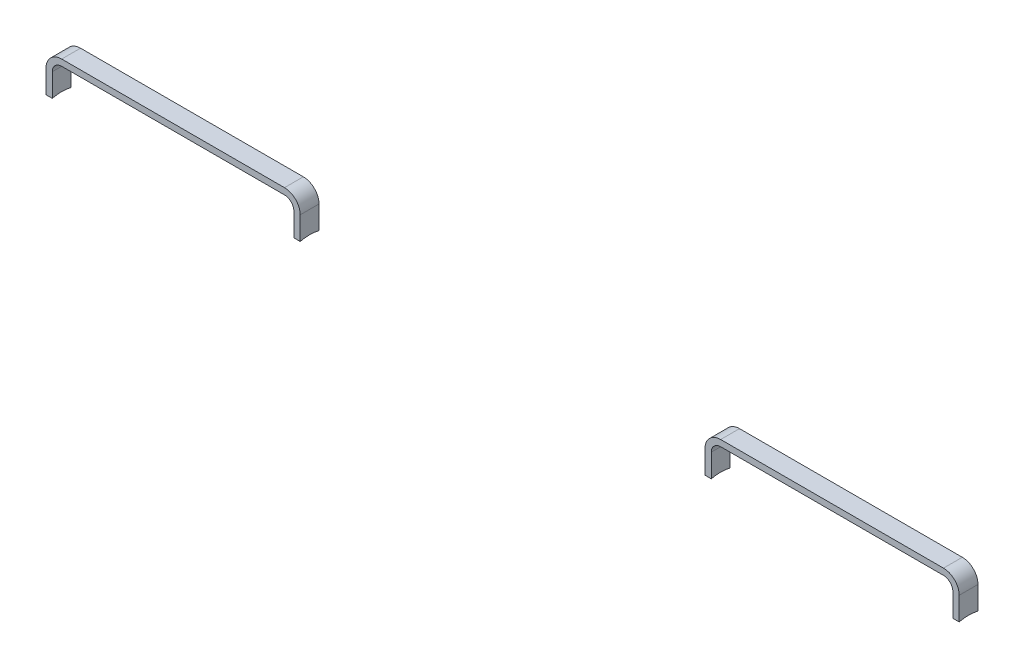
ISO-10303-21;
HEADER;
FILE_DESCRIPTION(('STEP AP214'),'2;1');
FILE_NAME('part.step','',(''),(''),'','','');
FILE_SCHEMA(('AUTOMOTIVE_DESIGN { 1 0 10303 214 1 1 1 1 }'));
ENDSEC;
DATA;
#1=APPLICATION_CONTEXT('core data for automotive mechanical design processes');
#2=APPLICATION_PROTOCOL_DEFINITION('international standard','automotive_design',2000,#1);
#3=PRODUCT_CONTEXT('',#1,'mechanical');
#4=PRODUCT('Part','Part','',(#3));
#5=PRODUCT_RELATED_PRODUCT_CATEGORY('part','',(#4));
#6=PRODUCT_DEFINITION_FORMATION('','',#4);
#7=PRODUCT_DEFINITION_CONTEXT('part definition',#1,'design');
#8=PRODUCT_DEFINITION('design','',#6,#7);
#9=PRODUCT_DEFINITION_SHAPE('','',#8);
#10=(LENGTH_UNIT() NAMED_UNIT(*) SI_UNIT(.MILLI.,.METRE.));
#11=(NAMED_UNIT(*) PLANE_ANGLE_UNIT() SI_UNIT($,.RADIAN.));
#12=(NAMED_UNIT(*) SI_UNIT($,.STERADIAN.) SOLID_ANGLE_UNIT());
#13=UNCERTAINTY_MEASURE_WITH_UNIT(LENGTH_MEASURE(1.E-05),#10,'distance_accuracy_value','');
#14=(GEOMETRIC_REPRESENTATION_CONTEXT(3) GLOBAL_UNCERTAINTY_ASSIGNED_CONTEXT((#13)) GLOBAL_UNIT_ASSIGNED_CONTEXT((#10,
#11,#12)) REPRESENTATION_CONTEXT('',''));
#15=CARTESIAN_POINT('',(0.,0.,0.));
#16=DIRECTION('',(0.,0.,1.));
#17=DIRECTION('',(1.,0.,0.));
#18=AXIS2_PLACEMENT_3D('',#15,#16,#17);
#19=CARTESIAN_POINT('',(140.5,609.700009353267,-1580.));
#20=DIRECTION('',(0.,0.,1.));
#21=DIRECTION('',(0.,-1.,0.));
#22=AXIS2_PLACEMENT_3D('',#19,#20,#21);
#23=CYLINDRICAL_SURFACE('',#22,5.);
#24=CARTESIAN_POINT('',(140.5,609.700009353267,-1577.));
#25=DIRECTION('',(0.,0.,-1.));
#26=DIRECTION('',(-1.,0.,0.));
#27=AXIS2_PLACEMENT_3D('',#24,#25,#26);
#28=CIRCLE('',#27,5.);
#29=CARTESIAN_POINT('',(140.5,614.700009353267,-1577.));
#30=VERTEX_POINT('',#29);
#31=CARTESIAN_POINT('',(145.5,609.700009353267,-1577.));
#32=VERTEX_POINT('',#31);
#33=EDGE_CURVE('E237',#30,#32,#28,.T.);
#34=ORIENTED_EDGE('',*,*,#33,.T.);
#35=DIRECTION('',(0.,0.,1.));
#36=VECTOR('',#35,1.);
#37=CARTESIAN_POINT('',(145.5,609.700009353267,-1580.));
#38=LINE('',#37,#36);
#39=CARTESIAN_POINT('',(145.5,609.700009353267,-1583.));
#40=VERTEX_POINT('',#39);
#41=EDGE_CURVE('E275',#40,#32,#38,.T.);
#42=ORIENTED_EDGE('',*,*,#41,.F.);
#43=CARTESIAN_POINT('',(140.5,609.700009353267,-1583.));
#44=DIRECTION('',(0.,0.,-1.));
#45=DIRECTION('',(-1.,0.,0.));
#46=AXIS2_PLACEMENT_3D('',#43,#44,#45);
#47=CIRCLE('',#46,5.);
#48=CARTESIAN_POINT('',(140.5,614.700009353267,-1583.));
#49=VERTEX_POINT('',#48);
#50=EDGE_CURVE('E286',#49,#40,#47,.T.);
#51=ORIENTED_EDGE('',*,*,#50,.F.);
#52=DIRECTION('',(0.,0.,1.));
#53=VECTOR('',#52,1.);
#54=CARTESIAN_POINT('',(140.5,614.700009353267,-1580.));
#55=LINE('',#54,#53);
#56=EDGE_CURVE('E269',#49,#30,#55,.T.);
#57=ORIENTED_EDGE('',*,*,#56,.T.);
#58=EDGE_LOOP('',(#34,#42,#51,#57));
#59=FACE_BOUND('',#58,.T.);
#60=ADVANCED_FACE('F142',(#59),#23,.T.);
#61=CARTESIAN_POINT('',(140.5,614.700009353267,-1580.));
#62=DIRECTION('',(0.,-1.,0.));
#63=DIRECTION('',(0.,0.,-1.));
#64=AXIS2_PLACEMENT_3D('',#61,#62,#63);
#65=PLANE('',#64);
#66=DIRECTION('',(-1.,0.,0.));
#67=VECTOR('',#66,1.);
#68=CARTESIAN_POINT('',(140.5,614.700009353267,-1577.));
#69=LINE('',#68,#67);
#70=CARTESIAN_POINT('',(69.5000000000004,614.700009353267,-1577.));
#71=VERTEX_POINT('',#70);
#72=EDGE_CURVE('E272',#30,#71,#69,.T.);
#73=ORIENTED_EDGE('',*,*,#72,.F.);
#74=ORIENTED_EDGE('',*,*,#56,.F.);
#75=DIRECTION('',(-1.,0.,0.));
#76=VECTOR('',#75,1.);
#77=CARTESIAN_POINT('',(140.5,614.700009353267,-1583.));
#78=LINE('',#77,#76);
#79=CARTESIAN_POINT('',(69.5000000000004,614.700009353267,-1583.));
#80=VERTEX_POINT('',#79);
#81=EDGE_CURVE('E266',#49,#80,#78,.T.);
#82=ORIENTED_EDGE('',*,*,#81,.T.);
#83=DIRECTION('',(0.,0.,1.));
#84=VECTOR('',#83,1.);
#85=CARTESIAN_POINT('',(69.5000000000004,614.700009353267,-1580.));
#86=LINE('',#85,#84);
#87=EDGE_CURVE('E271',#80,#71,#86,.T.);
#88=ORIENTED_EDGE('',*,*,#87,.T.);
#89=EDGE_LOOP('',(#73,#74,#82,#88));
#90=FACE_BOUND('',#89,.T.);
#91=ADVANCED_FACE('F366',(#90),#65,.F.);
#92=CARTESIAN_POINT('',(69.5000000000004,609.700009353267,-1580.));
#93=DIRECTION('',(0.,0.,1.));
#94=DIRECTION('',(0.,-1.,0.));
#95=AXIS2_PLACEMENT_3D('',#92,#93,#94);
#96=CYLINDRICAL_SURFACE('',#95,5.);
#97=CARTESIAN_POINT('',(69.5000000000004,609.700009353267,-1577.));
#98=DIRECTION('',(0.,0.,1.));
#99=DIRECTION('',(1.,0.,0.));
#100=AXIS2_PLACEMENT_3D('',#97,#98,#99);
#101=CIRCLE('',#100,5.);
#102=CARTESIAN_POINT('',(64.5000000000004,609.700009353267,-1577.));
#103=VERTEX_POINT('',#102);
#104=EDGE_CURVE('E353',#71,#103,#101,.T.);
#105=ORIENTED_EDGE('',*,*,#104,.F.);
#106=ORIENTED_EDGE('',*,*,#87,.F.);
#107=CARTESIAN_POINT('',(69.5000000000004,609.700009353267,-1583.));
#108=DIRECTION('',(0.,0.,1.));
#109=DIRECTION('',(1.,0.,0.));
#110=AXIS2_PLACEMENT_3D('',#107,#108,#109);
#111=CIRCLE('',#110,5.);
#112=CARTESIAN_POINT('',(64.5000000000004,609.700009353267,-1583.));
#113=VERTEX_POINT('',#112);
#114=EDGE_CURVE('E255',#80,#113,#111,.T.);
#115=ORIENTED_EDGE('',*,*,#114,.T.);
#116=DIRECTION('',(0.,0.,1.));
#117=VECTOR('',#116,1.);
#118=CARTESIAN_POINT('',(64.5000000000004,609.700009353267,-1580.));
#119=LINE('',#118,#117);
#120=EDGE_CURVE('E349',#113,#103,#119,.T.);
#121=ORIENTED_EDGE('',*,*,#120,.T.);
#122=EDGE_LOOP('',(#105,#106,#115,#121));
#123=FACE_BOUND('',#122,.T.);
#124=ADVANCED_FACE('F371',(#123),#96,.T.);
#125=CARTESIAN_POINT('',(69.5000000000004,609.700009353267,-1580.));
#126=DIRECTION('',(0.,0.,1.));
#127=DIRECTION('',(0.,-1.,0.));
#128=AXIS2_PLACEMENT_3D('',#125,#126,#127);
#129=CYLINDRICAL_SURFACE('',#128,3.);
#130=CARTESIAN_POINT('',(69.5000000000004,609.700009353267,-1577.));
#131=DIRECTION('',(0.,0.,1.));
#132=DIRECTION('',(1.,0.,0.));
#133=AXIS2_PLACEMENT_3D('',#130,#131,#132);
#134=CIRCLE('',#133,3.);
#135=CARTESIAN_POINT('',(69.5000000000004,612.700009353267,-1577.));
#136=VERTEX_POINT('',#135);
#137=CARTESIAN_POINT('',(66.5000000000004,609.700009353267,-1577.));
#138=VERTEX_POINT('',#137);
#139=EDGE_CURVE('E327',#136,#138,#134,.T.);
#140=ORIENTED_EDGE('',*,*,#139,.T.);
#141=DIRECTION('',(0.,0.,1.));
#142=VECTOR('',#141,1.);
#143=CARTESIAN_POINT('',(66.5000000000004,609.700009353267,-1580.));
#144=LINE('',#143,#142);
#145=CARTESIAN_POINT('',(66.5000000000004,609.700009353267,-1583.));
#146=VERTEX_POINT('',#145);
#147=EDGE_CURVE('E331',#146,#138,#144,.T.);
#148=ORIENTED_EDGE('',*,*,#147,.F.);
#149=CARTESIAN_POINT('',(69.5000000000004,609.700009353267,-1583.));
#150=DIRECTION('',(0.,0.,1.));
#151=DIRECTION('',(1.,0.,0.));
#152=AXIS2_PLACEMENT_3D('',#149,#150,#151);
#153=CIRCLE('',#152,3.);
#154=CARTESIAN_POINT('',(69.5000000000004,612.700009353267,-1583.));
#155=VERTEX_POINT('',#154);
#156=EDGE_CURVE('E249',#155,#146,#153,.T.);
#157=ORIENTED_EDGE('',*,*,#156,.F.);
#158=DIRECTION('',(0.,0.,1.));
#159=VECTOR('',#158,1.);
#160=CARTESIAN_POINT('',(69.5000000000004,612.700009353267,-1580.));
#161=LINE('',#160,#159);
#162=EDGE_CURVE('E320',#155,#136,#161,.T.);
#163=ORIENTED_EDGE('',*,*,#162,.T.);
#164=EDGE_LOOP('',(#140,#148,#157,#163));
#165=FACE_BOUND('',#164,.T.);
#166=ADVANCED_FACE('F419',(#165),#129,.F.);
#167=CARTESIAN_POINT('',(140.5,612.700009353267,-1580.));
#168=DIRECTION('',(0.,-1.,0.));
#169=DIRECTION('',(0.,0.,-1.));
#170=AXIS2_PLACEMENT_3D('',#167,#168,#169);
#171=PLANE('',#170);
#172=DIRECTION('',(-1.,0.,0.));
#173=VECTOR('',#172,1.);
#174=CARTESIAN_POINT('',(140.5,612.700009353267,-1577.));
#175=LINE('',#174,#173);
#176=CARTESIAN_POINT('',(140.5,612.700009353267,-1577.));
#177=VERTEX_POINT('',#176);
#178=EDGE_CURVE('E323',#177,#136,#175,.T.);
#179=ORIENTED_EDGE('',*,*,#178,.T.);
#180=ORIENTED_EDGE('',*,*,#162,.F.);
#181=DIRECTION('',(-1.,0.,0.));
#182=VECTOR('',#181,1.);
#183=CARTESIAN_POINT('',(140.5,612.700009353267,-1583.));
#184=LINE('',#183,#182);
#185=CARTESIAN_POINT('',(140.5,612.700009353267,-1583.));
#186=VERTEX_POINT('',#185);
#187=EDGE_CURVE('E253',#186,#155,#184,.T.);
#188=ORIENTED_EDGE('',*,*,#187,.F.);
#189=DIRECTION('',(0.,0.,1.));
#190=VECTOR('',#189,1.);
#191=CARTESIAN_POINT('',(140.5,612.700009353267,-1580.));
#192=LINE('',#191,#190);
#193=EDGE_CURVE('E329',#186,#177,#192,.T.);
#194=ORIENTED_EDGE('',*,*,#193,.T.);
#195=EDGE_LOOP('',(#179,#180,#188,#194));
#196=FACE_BOUND('',#195,.T.);
#197=ADVANCED_FACE('F321',(#196),#171,.T.);
#198=CARTESIAN_POINT('',(140.5,609.700009353267,-1580.));
#199=DIRECTION('',(0.,0.,1.));
#200=DIRECTION('',(0.,-1.,0.));
#201=AXIS2_PLACEMENT_3D('',#198,#199,#200);
#202=CYLINDRICAL_SURFACE('',#201,3.);
#203=CARTESIAN_POINT('',(140.5,609.700009353267,-1577.));
#204=DIRECTION('',(0.,0.,-1.));
#205=DIRECTION('',(-1.,0.,0.));
#206=AXIS2_PLACEMENT_3D('',#203,#204,#205);
#207=CIRCLE('',#206,3.);
#208=CARTESIAN_POINT('',(143.5,609.700009353267,-1577.));
#209=VERTEX_POINT('',#208);
#210=EDGE_CURVE('E514',#177,#209,#207,.T.);
#211=ORIENTED_EDGE('',*,*,#210,.F.);
#212=ORIENTED_EDGE('',*,*,#193,.F.);
#213=CARTESIAN_POINT('',(140.5,609.700009353267,-1583.));
#214=DIRECTION('',(0.,0.,-1.));
#215=DIRECTION('',(-1.,0.,0.));
#216=AXIS2_PLACEMENT_3D('',#213,#214,#215);
#217=CIRCLE('',#216,3.);
#218=CARTESIAN_POINT('',(143.5,609.700009353267,-1583.));
#219=VERTEX_POINT('',#218);
#220=EDGE_CURVE('E308',#186,#219,#217,.T.);
#221=ORIENTED_EDGE('',*,*,#220,.T.);
#222=DIRECTION('',(0.,0.,1.));
#223=VECTOR('',#222,1.);
#224=CARTESIAN_POINT('',(143.5,609.700009353267,-1580.));
#225=LINE('',#224,#223);
#226=EDGE_CURVE('E292',#219,#209,#225,.T.);
#227=ORIENTED_EDGE('',*,*,#226,.T.);
#228=EDGE_LOOP('',(#211,#212,#221,#227));
#229=FACE_BOUND('',#228,.T.);
#230=ADVANCED_FACE('F413',(#229),#202,.F.);
#231=CARTESIAN_POINT('',(0.,-6.10236207585869E-10,-1582.99999999977));
#232=DIRECTION('',(0.,-3.86227131201439E-13,-1.));
#233=DIRECTION('',(0.,1.,-3.86227131201439E-13));
#234=AXIS2_PLACEMENT_3D('',#231,#232,#233);
#235=PLANE('',#234);
#236=DIRECTION('',(0.,1.,0.));
#237=VECTOR('',#236,1.);
#238=CARTESIAN_POINT('',(145.5,590.000009353267,-1583.));
#239=LINE('',#238,#237);
#240=CARTESIAN_POINT('',(145.5,602.34059280787,-1583.));
#241=VERTEX_POINT('',#240);
#242=EDGE_CURVE('E296',#241,#40,#239,.T.);
#243=ORIENTED_EDGE('',*,*,#242,.F.);
#244=DIRECTION('',(-1.,0.,0.));
#245=VECTOR('',#244,1.);
#246=CARTESIAN_POINT('',(220.,602.34059280787,-1583.));
#247=LINE('',#246,#245);
#248=CARTESIAN_POINT('',(143.5,602.34059280787,-1583.));
#249=VERTEX_POINT('',#248);
#250=EDGE_CURVE('E13',#241,#249,#247,.T.);
#251=ORIENTED_EDGE('',*,*,#250,.T.);
#252=DIRECTION('',(0.,1.,0.));
#253=VECTOR('',#252,1.);
#254=CARTESIAN_POINT('',(143.5,590.000009353267,-1583.));
#255=LINE('',#254,#253);
#256=EDGE_CURVE('E299',#249,#219,#255,.T.);
#257=ORIENTED_EDGE('',*,*,#256,.T.);
#258=ORIENTED_EDGE('',*,*,#220,.F.);
#259=ORIENTED_EDGE('',*,*,#187,.T.);
#260=ORIENTED_EDGE('',*,*,#156,.T.);
#261=DIRECTION('',(0.,-1.,0.));
#262=VECTOR('',#261,1.);
#263=CARTESIAN_POINT('',(66.5000000000004,609.700009353267,-1583.));
#264=LINE('',#263,#262);
#265=CARTESIAN_POINT('',(66.5000000000003,602.34059280787,-1583.));
#266=VERTEX_POINT('',#265);
#267=EDGE_CURVE('E241',#146,#266,#264,.T.);
#268=ORIENTED_EDGE('',*,*,#267,.T.);
#269=CARTESIAN_POINT('',(64.5000000000003,602.34059280787,-1583.));
#270=VERTEX_POINT('',#269);
#271=EDGE_CURVE('E152',#266,#270,#247,.T.);
#272=ORIENTED_EDGE('',*,*,#271,.T.);
#273=DIRECTION('',(0.,-1.,0.));
#274=VECTOR('',#273,1.);
#275=CARTESIAN_POINT('',(64.5000000000004,609.700009353267,-1583.));
#276=LINE('',#275,#274);
#277=EDGE_CURVE('E251',#113,#270,#276,.T.);
#278=ORIENTED_EDGE('',*,*,#277,.F.);
#279=ORIENTED_EDGE('',*,*,#114,.F.);
#280=ORIENTED_EDGE('',*,*,#81,.F.);
#281=ORIENTED_EDGE('',*,*,#50,.T.);
#282=EDGE_LOOP('',(#243,#251,#257,#258,#259,#260,#268,#272,#278,#279,#280,#281));
#283=FACE_BOUND('',#282,.T.);
#284=ADVANCED_FACE('F247',(#283),#235,.T.);
#285=CARTESIAN_POINT('',(66.5000000000004,609.700009353267,-1580.));
#286=DIRECTION('',(1.,0.,0.));
#287=DIRECTION('',(0.,0.,1.));
#288=AXIS2_PLACEMENT_3D('',#285,#286,#287);
#289=PLANE('',#288);
#290=DIRECTION('',(0.,-1.,0.));
#291=VECTOR('',#290,1.);
#292=CARTESIAN_POINT('',(66.5000000000004,609.700009353267,-1577.));
#293=LINE('',#292,#291);
#294=CARTESIAN_POINT('',(66.5000000000003,602.340592807869,-1577.));
#295=VERTEX_POINT('',#294);
#296=EDGE_CURVE('E244',#138,#295,#293,.T.);
#297=ORIENTED_EDGE('',*,*,#296,.T.);
#298=CARTESIAN_POINT('',(66.5000000000003,590.000009353267,-1580.));
#299=DIRECTION('',(1.,0.,0.));
#300=DIRECTION('',(0.,0.,-1.));
#301=AXIS2_PLACEMENT_3D('',#298,#299,#300);
#302=CIRCLE('',#301,12.7);
#303=EDGE_CURVE('E232',#295,#266,#302,.F.);
#304=ORIENTED_EDGE('',*,*,#303,.T.);
#305=ORIENTED_EDGE('',*,*,#267,.F.);
#306=ORIENTED_EDGE('',*,*,#147,.T.);
#307=EDGE_LOOP('',(#297,#304,#305,#306));
#308=FACE_BOUND('',#307,.T.);
#309=ADVANCED_FACE('F240',(#308),#289,.T.);
#310=CARTESIAN_POINT('',(143.5,590.000009353267,-1580.));
#311=DIRECTION('',(-1.,0.,0.));
#312=DIRECTION('',(0.,0.,-1.));
#313=AXIS2_PLACEMENT_3D('',#310,#311,#312);
#314=PLANE('',#313);
#315=ORIENTED_EDGE('',*,*,#256,.F.);
#316=CARTESIAN_POINT('',(143.5,590.000009353267,-1580.));
#317=DIRECTION('',(-1.,0.,0.));
#318=DIRECTION('',(0.,0.,1.));
#319=AXIS2_PLACEMENT_3D('',#316,#317,#318);
#320=CIRCLE('',#319,12.7);
#321=CARTESIAN_POINT('',(143.5,602.340592807869,-1577.));
#322=VERTEX_POINT('',#321);
#323=EDGE_CURVE('E168',#249,#322,#320,.F.);
#324=ORIENTED_EDGE('',*,*,#323,.T.);
#325=DIRECTION('',(0.,1.,0.));
#326=VECTOR('',#325,1.);
#327=CARTESIAN_POINT('',(143.5,590.000009353267,-1577.));
#328=LINE('',#327,#326);
#329=EDGE_CURVE('E294',#322,#209,#328,.T.);
#330=ORIENTED_EDGE('',*,*,#329,.T.);
#331=ORIENTED_EDGE('',*,*,#226,.F.);
#332=EDGE_LOOP('',(#315,#324,#330,#331));
#333=FACE_BOUND('',#332,.T.);
#334=ADVANCED_FACE('F399',(#333),#314,.T.);
#335=CARTESIAN_POINT('',(145.5,590.000009353267,-1580.));
#336=DIRECTION('',(-1.,0.,0.));
#337=DIRECTION('',(0.,0.,-1.));
#338=AXIS2_PLACEMENT_3D('',#335,#336,#337);
#339=PLANE('',#338);
#340=CARTESIAN_POINT('',(145.5,590.000009353267,-1580.));
#341=DIRECTION('',(-1.,0.,0.));
#342=DIRECTION('',(0.,0.,1.));
#343=AXIS2_PLACEMENT_3D('',#340,#341,#342);
#344=CIRCLE('',#343,12.7);
#345=CARTESIAN_POINT('',(145.5,602.340592807869,-1577.));
#346=VERTEX_POINT('',#345);
#347=EDGE_CURVE('E382',#241,#346,#344,.F.);
#348=ORIENTED_EDGE('',*,*,#347,.F.);
#349=ORIENTED_EDGE('',*,*,#242,.T.);
#350=ORIENTED_EDGE('',*,*,#41,.T.);
#351=DIRECTION('',(0.,1.,0.));
#352=VECTOR('',#351,1.);
#353=CARTESIAN_POINT('',(145.5,590.000009353267,-1577.));
#354=LINE('',#353,#352);
#355=EDGE_CURVE('E146',#346,#32,#354,.T.);
#356=ORIENTED_EDGE('',*,*,#355,.F.);
#357=EDGE_LOOP('',(#348,#349,#350,#356));
#358=FACE_BOUND('',#357,.T.);
#359=ADVANCED_FACE('F393',(#358),#339,.F.);
#360=CARTESIAN_POINT('',(64.5000000000004,609.700009353267,-1580.));
#361=DIRECTION('',(1.,0.,0.));
#362=DIRECTION('',(0.,0.,1.));
#363=AXIS2_PLACEMENT_3D('',#360,#361,#362);
#364=PLANE('',#363);
#365=CARTESIAN_POINT('',(64.5000000000003,590.000009353267,-1580.));
#366=DIRECTION('',(1.,0.,0.));
#367=DIRECTION('',(0.,0.,-1.));
#368=AXIS2_PLACEMENT_3D('',#365,#366,#367);
#369=CIRCLE('',#368,12.7);
#370=CARTESIAN_POINT('',(64.5000000000003,602.340592807869,-1577.));
#371=VERTEX_POINT('',#370);
#372=EDGE_CURVE('E160',#371,#270,#369,.F.);
#373=ORIENTED_EDGE('',*,*,#372,.F.);
#374=DIRECTION('',(0.,-1.,0.));
#375=VECTOR('',#374,1.);
#376=CARTESIAN_POINT('',(64.5000000000004,609.700009353267,-1577.));
#377=LINE('',#376,#375);
#378=EDGE_CURVE('E344',#103,#371,#377,.T.);
#379=ORIENTED_EDGE('',*,*,#378,.F.);
#380=ORIENTED_EDGE('',*,*,#120,.F.);
#381=ORIENTED_EDGE('',*,*,#277,.T.);
#382=EDGE_LOOP('',(#373,#379,#380,#381));
#383=FACE_BOUND('',#382,.T.);
#384=ADVANCED_FACE('F391',(#383),#364,.F.);
#385=CARTESIAN_POINT('',(0.,-6.10241527010497E-10,-1576.99999999977));
#386=DIRECTION('',(0.,-3.86227131201439E-13,-1.));
#387=DIRECTION('',(0.,1.,-3.86227131201439E-13));
#388=AXIS2_PLACEMENT_3D('',#385,#386,#387);
#389=PLANE('',#388);
#390=DIRECTION('',(-1.,0.,0.));
#391=VECTOR('',#390,1.);
#392=CARTESIAN_POINT('',(220.,602.340592807869,-1577.));
#393=LINE('',#392,#391);
#394=EDGE_CURVE('E381',#346,#322,#393,.T.);
#395=ORIENTED_EDGE('',*,*,#394,.F.);
#396=ORIENTED_EDGE('',*,*,#355,.T.);
#397=ORIENTED_EDGE('',*,*,#33,.F.);
#398=ORIENTED_EDGE('',*,*,#72,.T.);
#399=ORIENTED_EDGE('',*,*,#104,.T.);
#400=ORIENTED_EDGE('',*,*,#378,.T.);
#401=EDGE_CURVE('E384',#295,#371,#393,.T.);
#402=ORIENTED_EDGE('',*,*,#401,.F.);
#403=ORIENTED_EDGE('',*,*,#296,.F.);
#404=ORIENTED_EDGE('',*,*,#139,.F.);
#405=ORIENTED_EDGE('',*,*,#178,.F.);
#406=ORIENTED_EDGE('',*,*,#210,.T.);
#407=ORIENTED_EDGE('',*,*,#329,.F.);
#408=EDGE_LOOP('',(#395,#396,#397,#398,#399,#400,#402,#403,#404,#405,#406,#407));
#409=FACE_BOUND('',#408,.T.);
#410=ADVANCED_FACE('F144',(#409),#389,.F.);
#411=CARTESIAN_POINT('',(220.,590.000009353267,-1580.));
#412=DIRECTION('',(-1.,0.,0.));
#413=DIRECTION('',(0.,0.,1.));
#414=AXIS2_PLACEMENT_3D('',#411,#412,#413);
#415=CYLINDRICAL_SURFACE('',#414,12.7);
#416=ORIENTED_EDGE('',*,*,#401,.T.);
#417=ORIENTED_EDGE('',*,*,#372,.T.);
#418=ORIENTED_EDGE('',*,*,#271,.F.);
#419=ORIENTED_EDGE('',*,*,#303,.F.);
#420=EDGE_LOOP('',(#416,#417,#418,#419));
#421=FACE_BOUND('',#420,.T.);
#422=ADVANCED_FACE('F231',(#421),#415,.F.);
#423=ORIENTED_EDGE('',*,*,#394,.T.);
#424=ORIENTED_EDGE('',*,*,#323,.F.);
#425=ORIENTED_EDGE('',*,*,#250,.F.);
#426=ORIENTED_EDGE('',*,*,#347,.T.);
#427=EDGE_LOOP('',(#423,#424,#425,#426));
#428=FACE_BOUND('',#427,.T.);
#429=ADVANCED_FACE('F429',(#428),#415,.F.);
#430=CLOSED_SHELL('',(#60,#91,#124,#166,#197,#230,#284,#309,#334,#359,#384,#410,#422,#429));
#431=MANIFOLD_SOLID_BREP('B2',#430);
#432=CARTESIAN_POINT('',(-69.5000000000004,609.700009353267,-1580.));
#433=DIRECTION('',(0.,0.,1.));
#434=DIRECTION('',(0.,-1.,0.));
#435=AXIS2_PLACEMENT_3D('',#432,#433,#434);
#436=CYLINDRICAL_SURFACE('',#435,5.);
#437=CARTESIAN_POINT('',(-69.5000000000004,609.700009353267,-1577.));
#438=DIRECTION('',(0.,0.,-1.));
#439=DIRECTION('',(-1.,0.,0.));
#440=AXIS2_PLACEMENT_3D('',#437,#438,#439);
#441=CIRCLE('',#440,5.);
#442=CARTESIAN_POINT('',(-69.5000000000004,614.700009353267,-1577.));
#443=VERTEX_POINT('',#442);
#444=CARTESIAN_POINT('',(-64.5000000000004,609.700009353267,-1577.));
#445=VERTEX_POINT('',#444);
#446=EDGE_CURVE('E760',#443,#445,#441,.T.);
#447=ORIENTED_EDGE('',*,*,#446,.T.);
#448=DIRECTION('',(0.,0.,1.));
#449=VECTOR('',#448,1.);
#450=CARTESIAN_POINT('',(-64.5000000000004,609.700009353267,-1580.));
#451=LINE('',#450,#449);
#452=CARTESIAN_POINT('',(-64.5000000000004,609.700009353267,-1583.));
#453=VERTEX_POINT('',#452);
#454=EDGE_CURVE('E755',#453,#445,#451,.T.);
#455=ORIENTED_EDGE('',*,*,#454,.F.);
#456=CARTESIAN_POINT('',(-69.5000000000004,609.700009353267,-1583.));
#457=DIRECTION('',(0.,0.,-1.));
#458=DIRECTION('',(-1.,0.,0.));
#459=AXIS2_PLACEMENT_3D('',#456,#457,#458);
#460=CIRCLE('',#459,5.);
#461=CARTESIAN_POINT('',(-69.5000000000004,614.700009353267,-1583.));
#462=VERTEX_POINT('',#461);
#463=EDGE_CURVE('E680',#462,#453,#460,.T.);
#464=ORIENTED_EDGE('',*,*,#463,.F.);
#465=DIRECTION('',(0.,0.,1.));
#466=VECTOR('',#465,1.);
#467=CARTESIAN_POINT('',(-69.5000000000004,614.700009353267,-1580.));
#468=LINE('',#467,#466);
#469=EDGE_CURVE('E691',#462,#443,#468,.T.);
#470=ORIENTED_EDGE('',*,*,#469,.T.);
#471=EDGE_LOOP('',(#447,#455,#464,#470));
#472=FACE_BOUND('',#471,.T.);
#473=ADVANCED_FACE('F537',(#472),#436,.T.);
#474=CARTESIAN_POINT('',(-140.5,614.700009353267,-1580.));
#475=DIRECTION('',(0.,-1.,0.));
#476=DIRECTION('',(0.,0.,-1.));
#477=AXIS2_PLACEMENT_3D('',#474,#475,#476);
#478=PLANE('',#477);
#479=DIRECTION('',(1.,0.,0.));
#480=VECTOR('',#479,1.);
#481=CARTESIAN_POINT('',(-140.5,614.700009353267,-1577.));
#482=LINE('',#481,#480);
#483=CARTESIAN_POINT('',(-140.5,614.700009353267,-1577.));
#484=VERTEX_POINT('',#483);
#485=EDGE_CURVE('E692',#484,#443,#482,.T.);
#486=ORIENTED_EDGE('',*,*,#485,.T.);
#487=ORIENTED_EDGE('',*,*,#469,.F.);
#488=DIRECTION('',(1.,0.,0.));
#489=VECTOR('',#488,1.);
#490=CARTESIAN_POINT('',(-140.5,614.700009353267,-1583.));
#491=LINE('',#490,#489);
#492=CARTESIAN_POINT('',(-140.5,614.700009353267,-1583.));
#493=VERTEX_POINT('',#492);
#494=EDGE_CURVE('E685',#493,#462,#491,.T.);
#495=ORIENTED_EDGE('',*,*,#494,.F.);
#496=DIRECTION('',(0.,0.,1.));
#497=VECTOR('',#496,1.);
#498=CARTESIAN_POINT('',(-140.5,614.700009353267,-1580.));
#499=LINE('',#498,#497);
#500=EDGE_CURVE('E688',#493,#484,#499,.T.);
#501=ORIENTED_EDGE('',*,*,#500,.T.);
#502=EDGE_LOOP('',(#486,#487,#495,#501));
#503=FACE_BOUND('',#502,.T.);
#504=ADVANCED_FACE('F799',(#503),#478,.F.);
#505=CARTESIAN_POINT('',(-140.5,609.700009353267,-1580.));
#506=DIRECTION('',(0.,0.,1.));
#507=DIRECTION('',(0.,-1.,0.));
#508=AXIS2_PLACEMENT_3D('',#505,#506,#507);
#509=CYLINDRICAL_SURFACE('',#508,5.);
#510=CARTESIAN_POINT('',(-140.5,609.700009353267,-1577.));
#511=DIRECTION('',(0.,0.,1.));
#512=DIRECTION('',(1.,0.,0.));
#513=AXIS2_PLACEMENT_3D('',#510,#511,#512);
#514=CIRCLE('',#513,5.);
#515=CARTESIAN_POINT('',(-145.5,609.700009353267,-1577.));
#516=VERTEX_POINT('',#515);
#517=EDGE_CURVE('E632',#484,#516,#514,.T.);
#518=ORIENTED_EDGE('',*,*,#517,.F.);
#519=ORIENTED_EDGE('',*,*,#500,.F.);
#520=CARTESIAN_POINT('',(-140.5,609.700009353267,-1583.));
#521=DIRECTION('',(0.,0.,1.));
#522=DIRECTION('',(1.,0.,0.));
#523=AXIS2_PLACEMENT_3D('',#520,#521,#522);
#524=CIRCLE('',#523,5.);
#525=CARTESIAN_POINT('',(-145.5,609.700009353267,-1583.));
#526=VERTEX_POINT('',#525);
#527=EDGE_CURVE('E649',#493,#526,#524,.T.);
#528=ORIENTED_EDGE('',*,*,#527,.T.);
#529=DIRECTION('',(0.,0.,1.));
#530=VECTOR('',#529,1.);
#531=CARTESIAN_POINT('',(-145.5,609.700009353267,-1580.));
#532=LINE('',#531,#530);
#533=EDGE_CURVE('E695',#526,#516,#532,.T.);
#534=ORIENTED_EDGE('',*,*,#533,.T.);
#535=EDGE_LOOP('',(#518,#519,#528,#534));
#536=FACE_BOUND('',#535,.T.);
#537=ADVANCED_FACE('F798',(#536),#509,.T.);
#538=CARTESIAN_POINT('',(-140.5,609.700009353267,-1580.));
#539=DIRECTION('',(0.,0.,1.));
#540=DIRECTION('',(0.,-1.,0.));
#541=AXIS2_PLACEMENT_3D('',#538,#539,#540);
#542=CYLINDRICAL_SURFACE('',#541,3.);
#543=CARTESIAN_POINT('',(-140.5,609.700009353267,-1577.));
#544=DIRECTION('',(0.,0.,1.));
#545=DIRECTION('',(1.,0.,0.));
#546=AXIS2_PLACEMENT_3D('',#543,#544,#545);
#547=CIRCLE('',#546,3.);
#548=CARTESIAN_POINT('',(-140.5,612.700009353267,-1577.));
#549=VERTEX_POINT('',#548);
#550=CARTESIAN_POINT('',(-143.5,609.700009353267,-1577.));
#551=VERTEX_POINT('',#550);
#552=EDGE_CURVE('E715',#549,#551,#547,.T.);
#553=ORIENTED_EDGE('',*,*,#552,.T.);
#554=DIRECTION('',(0.,0.,1.));
#555=VECTOR('',#554,1.);
#556=CARTESIAN_POINT('',(-143.5,609.700009353267,-1580.));
#557=LINE('',#556,#555);
#558=CARTESIAN_POINT('',(-143.5,609.700009353267,-1583.));
#559=VERTEX_POINT('',#558);
#560=EDGE_CURVE('E710',#559,#551,#557,.T.);
#561=ORIENTED_EDGE('',*,*,#560,.F.);
#562=CARTESIAN_POINT('',(-140.5,609.700009353267,-1583.));
#563=DIRECTION('',(0.,0.,1.));
#564=DIRECTION('',(1.,0.,0.));
#565=AXIS2_PLACEMENT_3D('',#562,#563,#564);
#566=CIRCLE('',#565,3.);
#567=CARTESIAN_POINT('',(-140.5,612.700009353267,-1583.));
#568=VERTEX_POINT('',#567);
#569=EDGE_CURVE('E646',#568,#559,#566,.T.);
#570=ORIENTED_EDGE('',*,*,#569,.F.);
#571=DIRECTION('',(0.,0.,1.));
#572=VECTOR('',#571,1.);
#573=CARTESIAN_POINT('',(-140.5,612.700009353267,-1580.));
#574=LINE('',#573,#572);
#575=EDGE_CURVE('E716',#568,#549,#574,.T.);
#576=ORIENTED_EDGE('',*,*,#575,.T.);
#577=EDGE_LOOP('',(#553,#561,#570,#576));
#578=FACE_BOUND('',#577,.T.);
#579=ADVANCED_FACE('F806',(#578),#542,.F.);
#580=CARTESIAN_POINT('',(-140.5,612.700009353267,-1580.));
#581=DIRECTION('',(0.,-1.,0.));
#582=DIRECTION('',(0.,0.,-1.));
#583=AXIS2_PLACEMENT_3D('',#580,#581,#582);
#584=PLANE('',#583);
#585=DIRECTION('',(1.,0.,0.));
#586=VECTOR('',#585,1.);
#587=CARTESIAN_POINT('',(-140.5,612.700009353267,-1577.));
#588=LINE('',#587,#586);
#589=CARTESIAN_POINT('',(-69.5000000000004,612.700009353267,-1577.));
#590=VERTEX_POINT('',#589);
#591=EDGE_CURVE('E720',#549,#590,#588,.T.);
#592=ORIENTED_EDGE('',*,*,#591,.F.);
#593=ORIENTED_EDGE('',*,*,#575,.F.);
#594=DIRECTION('',(1.,0.,0.));
#595=VECTOR('',#594,1.);
#596=CARTESIAN_POINT('',(-140.5,612.700009353267,-1583.));
#597=LINE('',#596,#595);
#598=CARTESIAN_POINT('',(-69.5000000000004,612.700009353267,-1583.));
#599=VERTEX_POINT('',#598);
#600=EDGE_CURVE('E651',#568,#599,#597,.T.);
#601=ORIENTED_EDGE('',*,*,#600,.T.);
#602=DIRECTION('',(0.,0.,1.));
#603=VECTOR('',#602,1.);
#604=CARTESIAN_POINT('',(-69.5000000000004,612.700009353267,-1580.));
#605=LINE('',#604,#603);
#606=EDGE_CURVE('E730',#599,#590,#605,.T.);
#607=ORIENTED_EDGE('',*,*,#606,.T.);
#608=EDGE_LOOP('',(#592,#593,#601,#607));
#609=FACE_BOUND('',#608,.T.);
#610=ADVANCED_FACE('F820',(#609),#584,.T.);
#611=CARTESIAN_POINT('',(-69.5000000000004,609.700009353267,-1580.));
#612=DIRECTION('',(0.,0.,1.));
#613=DIRECTION('',(0.,-1.,0.));
#614=AXIS2_PLACEMENT_3D('',#611,#612,#613);
#615=CYLINDRICAL_SURFACE('',#614,3.);
#616=CARTESIAN_POINT('',(-69.5000000000004,609.700009353267,-1577.));
#617=DIRECTION('',(0.,0.,-1.));
#618=DIRECTION('',(-1.,0.,0.));
#619=AXIS2_PLACEMENT_3D('',#616,#617,#618);
#620=CIRCLE('',#619,3.);
#621=CARTESIAN_POINT('',(-66.5000000000004,609.700009353267,-1577.));
#622=VERTEX_POINT('',#621);
#623=EDGE_CURVE('E735',#590,#622,#620,.T.);
#624=ORIENTED_EDGE('',*,*,#623,.F.);
#625=ORIENTED_EDGE('',*,*,#606,.F.);
#626=CARTESIAN_POINT('',(-69.5000000000004,609.700009353267,-1583.));
#627=DIRECTION('',(0.,0.,-1.));
#628=DIRECTION('',(-1.,0.,0.));
#629=AXIS2_PLACEMENT_3D('',#626,#627,#628);
#630=CIRCLE('',#629,3.);
#631=CARTESIAN_POINT('',(-66.5000000000004,609.700009353267,-1583.));
#632=VERTEX_POINT('',#631);
#633=EDGE_CURVE('E666',#599,#632,#630,.T.);
#634=ORIENTED_EDGE('',*,*,#633,.T.);
#635=DIRECTION('',(0.,0.,1.));
#636=VECTOR('',#635,1.);
#637=CARTESIAN_POINT('',(-66.5000000000004,609.700009353267,-1580.));
#638=LINE('',#637,#636);
#639=EDGE_CURVE('E740',#632,#622,#638,.T.);
#640=ORIENTED_EDGE('',*,*,#639,.T.);
#641=EDGE_LOOP('',(#624,#625,#634,#640));
#642=FACE_BOUND('',#641,.T.);
#643=ADVANCED_FACE('F817',(#642),#615,.F.);
#644=CARTESIAN_POINT('',(0.,-6.10236207585869E-10,-1582.99999999977));
#645=DIRECTION('',(0.,-3.86227131201439E-13,-1.));
#646=DIRECTION('',(0.,1.,-3.86227131201439E-13));
#647=AXIS2_PLACEMENT_3D('',#644,#645,#646);
#648=PLANE('',#647);
#649=DIRECTION('',(0.,-1.,0.));
#650=VECTOR('',#649,1.);
#651=CARTESIAN_POINT('',(-64.5000000000004,609.700009353267,-1583.));
#652=LINE('',#651,#650);
#653=CARTESIAN_POINT('',(-64.5000000000003,602.34059280787,-1583.));
#654=VERTEX_POINT('',#653);
#655=EDGE_CURVE('E676',#453,#654,#652,.T.);
#656=ORIENTED_EDGE('',*,*,#655,.T.);
#657=DIRECTION('',(-1.,0.,0.));
#658=VECTOR('',#657,1.);
#659=CARTESIAN_POINT('',(220.,602.34059280787,-1583.));
#660=LINE('',#659,#658);
#661=CARTESIAN_POINT('',(-66.5000000000003,602.34059280787,-1583.));
#662=VERTEX_POINT('',#661);
#663=EDGE_CURVE('E140',#654,#662,#660,.T.);
#664=ORIENTED_EDGE('',*,*,#663,.T.);
#665=DIRECTION('',(0.,-1.,0.));
#666=VECTOR('',#665,1.);
#667=CARTESIAN_POINT('',(-66.5000000000004,609.700009353267,-1583.));
#668=LINE('',#667,#666);
#669=EDGE_CURVE('E671',#632,#662,#668,.T.);
#670=ORIENTED_EDGE('',*,*,#669,.F.);
#671=ORIENTED_EDGE('',*,*,#633,.F.);
#672=ORIENTED_EDGE('',*,*,#600,.F.);
#673=ORIENTED_EDGE('',*,*,#569,.T.);
#674=DIRECTION('',(0.,1.,0.));
#675=VECTOR('',#674,1.);
#676=CARTESIAN_POINT('',(-143.5,590.000009353267,-1583.));
#677=LINE('',#676,#675);
#678=CARTESIAN_POINT('',(-143.5,602.34059280787,-1583.));
#679=VERTEX_POINT('',#678);
#680=EDGE_CURVE('E637',#679,#559,#677,.T.);
#681=ORIENTED_EDGE('',*,*,#680,.F.);
#682=CARTESIAN_POINT('',(-145.5,602.34059280787,-1583.));
#683=VERTEX_POINT('',#682);
#684=EDGE_CURVE('E547',#679,#683,#660,.T.);
#685=ORIENTED_EDGE('',*,*,#684,.T.);
#686=DIRECTION('',(0.,1.,0.));
#687=VECTOR('',#686,1.);
#688=CARTESIAN_POINT('',(-145.5,590.000009353267,-1583.));
#689=LINE('',#688,#687);
#690=EDGE_CURVE('E647',#683,#526,#689,.T.);
#691=ORIENTED_EDGE('',*,*,#690,.T.);
#692=ORIENTED_EDGE('',*,*,#527,.F.);
#693=ORIENTED_EDGE('',*,*,#494,.T.);
#694=ORIENTED_EDGE('',*,*,#463,.T.);
#695=EDGE_LOOP('',(#656,#664,#670,#671,#672,#673,#681,#685,#691,#692,#693,#694));
#696=FACE_BOUND('',#695,.T.);
#697=ADVANCED_FACE('F643',(#696),#648,.T.);
#698=CARTESIAN_POINT('',(-66.5000000000004,609.700009353267,-1580.));
#699=DIRECTION('',(-1.,0.,0.));
#700=DIRECTION('',(0.,0.,1.));
#701=AXIS2_PLACEMENT_3D('',#698,#699,#700);
#702=PLANE('',#701);
#703=ORIENTED_EDGE('',*,*,#669,.T.);
#704=CARTESIAN_POINT('',(-66.5000000000003,590.000009353267,-1580.));
#705=DIRECTION('',(-1.,0.,0.));
#706=DIRECTION('',(0.,0.,1.));
#707=AXIS2_PLACEMENT_3D('',#704,#705,#706);
#708=CIRCLE('',#707,12.7);
#709=CARTESIAN_POINT('',(-66.5000000000003,602.340592807869,-1577.));
#710=VERTEX_POINT('',#709);
#711=EDGE_CURVE('E563',#662,#710,#708,.F.);
#712=ORIENTED_EDGE('',*,*,#711,.T.);
#713=DIRECTION('',(0.,-1.,0.));
#714=VECTOR('',#713,1.);
#715=CARTESIAN_POINT('',(-66.5000000000004,609.700009353267,-1577.));
#716=LINE('',#715,#714);
#717=EDGE_CURVE('E745',#622,#710,#716,.T.);
#718=ORIENTED_EDGE('',*,*,#717,.F.);
#719=ORIENTED_EDGE('',*,*,#639,.F.);
#720=EDGE_LOOP('',(#703,#712,#718,#719));
#721=FACE_BOUND('',#720,.T.);
#722=ADVANCED_FACE('F813',(#721),#702,.T.);
#723=CARTESIAN_POINT('',(-143.5,590.000009353267,-1580.));
#724=DIRECTION('',(1.,0.,0.));
#725=DIRECTION('',(0.,0.,-1.));
#726=AXIS2_PLACEMENT_3D('',#723,#724,#725);
#727=PLANE('',#726);
#728=DIRECTION('',(0.,1.,0.));
#729=VECTOR('',#728,1.);
#730=CARTESIAN_POINT('',(-143.5,590.000009353267,-1577.));
#731=LINE('',#730,#729);
#732=CARTESIAN_POINT('',(-143.5,602.340592807869,-1577.));
#733=VERTEX_POINT('',#732);
#734=EDGE_CURVE('E639',#733,#551,#731,.T.);
#735=ORIENTED_EDGE('',*,*,#734,.F.);
#736=CARTESIAN_POINT('',(-143.5,590.000009353267,-1580.));
#737=DIRECTION('',(1.,0.,0.));
#738=DIRECTION('',(0.,0.,-1.));
#739=AXIS2_PLACEMENT_3D('',#736,#737,#738);
#740=CIRCLE('',#739,12.7);
#741=EDGE_CURVE('E627',#733,#679,#740,.F.);
#742=ORIENTED_EDGE('',*,*,#741,.T.);
#743=ORIENTED_EDGE('',*,*,#680,.T.);
#744=ORIENTED_EDGE('',*,*,#560,.T.);
#745=EDGE_LOOP('',(#735,#742,#743,#744));
#746=FACE_BOUND('',#745,.T.);
#747=ADVANCED_FACE('F635',(#746),#727,.T.);
#748=CARTESIAN_POINT('',(-145.5,590.000009353267,-1580.));
#749=DIRECTION('',(1.,0.,0.));
#750=DIRECTION('',(0.,0.,-1.));
#751=AXIS2_PLACEMENT_3D('',#748,#749,#750);
#752=PLANE('',#751);
#753=CARTESIAN_POINT('',(-145.5,590.000009353267,-1580.));
#754=DIRECTION('',(1.,0.,0.));
#755=DIRECTION('',(0.,0.,-1.));
#756=AXIS2_PLACEMENT_3D('',#753,#754,#755);
#757=CIRCLE('',#756,12.7);
#758=CARTESIAN_POINT('',(-145.5,602.340592807869,-1577.));
#759=VERTEX_POINT('',#758);
#760=EDGE_CURVE('E555',#759,#683,#757,.F.);
#761=ORIENTED_EDGE('',*,*,#760,.F.);
#762=DIRECTION('',(0.,1.,0.));
#763=VECTOR('',#762,1.);
#764=CARTESIAN_POINT('',(-145.5,590.000009353267,-1577.));
#765=LINE('',#764,#763);
#766=EDGE_CURVE('E541',#759,#516,#765,.T.);
#767=ORIENTED_EDGE('',*,*,#766,.T.);
#768=ORIENTED_EDGE('',*,*,#533,.F.);
#769=ORIENTED_EDGE('',*,*,#690,.F.);
#770=EDGE_LOOP('',(#761,#767,#768,#769));
#771=FACE_BOUND('',#770,.T.);
#772=ADVANCED_FACE('F795',(#771),#752,.F.);
#773=CARTESIAN_POINT('',(-64.5000000000004,609.700009353267,-1580.));
#774=DIRECTION('',(-1.,0.,0.));
#775=DIRECTION('',(0.,0.,1.));
#776=AXIS2_PLACEMENT_3D('',#773,#774,#775);
#777=PLANE('',#776);
#778=CARTESIAN_POINT('',(-64.5000000000003,590.000009353267,-1580.));
#779=DIRECTION('',(-1.,0.,0.));
#780=DIRECTION('',(0.,0.,1.));
#781=AXIS2_PLACEMENT_3D('',#778,#779,#780);
#782=CIRCLE('',#781,12.7);
#783=CARTESIAN_POINT('',(-64.5000000000003,602.340592807869,-1577.));
#784=VERTEX_POINT('',#783);
#785=EDGE_CURVE('E780',#654,#784,#782,.F.);
#786=ORIENTED_EDGE('',*,*,#785,.F.);
#787=ORIENTED_EDGE('',*,*,#655,.F.);
#788=ORIENTED_EDGE('',*,*,#454,.T.);
#789=DIRECTION('',(0.,-1.,0.));
#790=VECTOR('',#789,1.);
#791=CARTESIAN_POINT('',(-64.5000000000004,609.700009353267,-1577.));
#792=LINE('',#791,#790);
#793=EDGE_CURVE('E750',#445,#784,#792,.T.);
#794=ORIENTED_EDGE('',*,*,#793,.T.);
#795=EDGE_LOOP('',(#786,#787,#788,#794));
#796=FACE_BOUND('',#795,.T.);
#797=ADVANCED_FACE('F778',(#796),#777,.F.);
#798=CARTESIAN_POINT('',(0.,-6.10241527010497E-10,-1576.99999999977));
#799=DIRECTION('',(0.,-3.86227131201439E-13,-1.));
#800=DIRECTION('',(0.,1.,-3.86227131201439E-13));
#801=AXIS2_PLACEMENT_3D('',#798,#799,#800);
#802=PLANE('',#801);
#803=DIRECTION('',(-1.,0.,0.));
#804=VECTOR('',#803,1.);
#805=CARTESIAN_POINT('',(220.,602.340592807869,-1577.));
#806=LINE('',#805,#804);
#807=EDGE_CURVE('E775',#784,#710,#806,.T.);
#808=ORIENTED_EDGE('',*,*,#807,.F.);
#809=ORIENTED_EDGE('',*,*,#793,.F.);
#810=ORIENTED_EDGE('',*,*,#446,.F.);
#811=ORIENTED_EDGE('',*,*,#485,.F.);
#812=ORIENTED_EDGE('',*,*,#517,.T.);
#813=ORIENTED_EDGE('',*,*,#766,.F.);
#814=EDGE_CURVE('E785',#733,#759,#806,.T.);
#815=ORIENTED_EDGE('',*,*,#814,.F.);
#816=ORIENTED_EDGE('',*,*,#734,.T.);
#817=ORIENTED_EDGE('',*,*,#552,.F.);
#818=ORIENTED_EDGE('',*,*,#591,.T.);
#819=ORIENTED_EDGE('',*,*,#623,.T.);
#820=ORIENTED_EDGE('',*,*,#717,.T.);
#821=EDGE_LOOP('',(#808,#809,#810,#811,#812,#813,#815,#816,#817,#818,#819,#820));
#822=FACE_BOUND('',#821,.T.);
#823=ADVANCED_FACE('F539',(#822),#802,.F.);
#824=CARTESIAN_POINT('',(220.,590.000009353267,-1580.));
#825=DIRECTION('',(-1.,0.,0.));
#826=DIRECTION('',(0.,0.,1.));
#827=AXIS2_PLACEMENT_3D('',#824,#825,#826);
#828=CYLINDRICAL_SURFACE('',#827,12.7);
#829=ORIENTED_EDGE('',*,*,#814,.T.);
#830=ORIENTED_EDGE('',*,*,#760,.T.);
#831=ORIENTED_EDGE('',*,*,#684,.F.);
#832=ORIENTED_EDGE('',*,*,#741,.F.);
#833=EDGE_LOOP('',(#829,#830,#831,#832));
#834=FACE_BOUND('',#833,.T.);
#835=ADVANCED_FACE('F626',(#834),#828,.F.);
#836=ORIENTED_EDGE('',*,*,#807,.T.);
#837=ORIENTED_EDGE('',*,*,#711,.F.);
#838=ORIENTED_EDGE('',*,*,#663,.F.);
#839=ORIENTED_EDGE('',*,*,#785,.T.);
#840=EDGE_LOOP('',(#836,#837,#838,#839));
#841=FACE_BOUND('',#840,.T.);
#842=ADVANCED_FACE('F849',(#841),#828,.F.);
#843=CLOSED_SHELL('',(#473,#504,#537,#579,#610,#643,#697,#722,#747,#772,#797,#823,#835,#842));
#844=MANIFOLD_SOLID_BREP('B7',#843);
#845=ADVANCED_BREP_SHAPE_REPRESENTATION('',(#18,#431,#844),#14);
#846=SHAPE_DEFINITION_REPRESENTATION(#9,#845);
ENDSEC;
END-ISO-10303-21;
